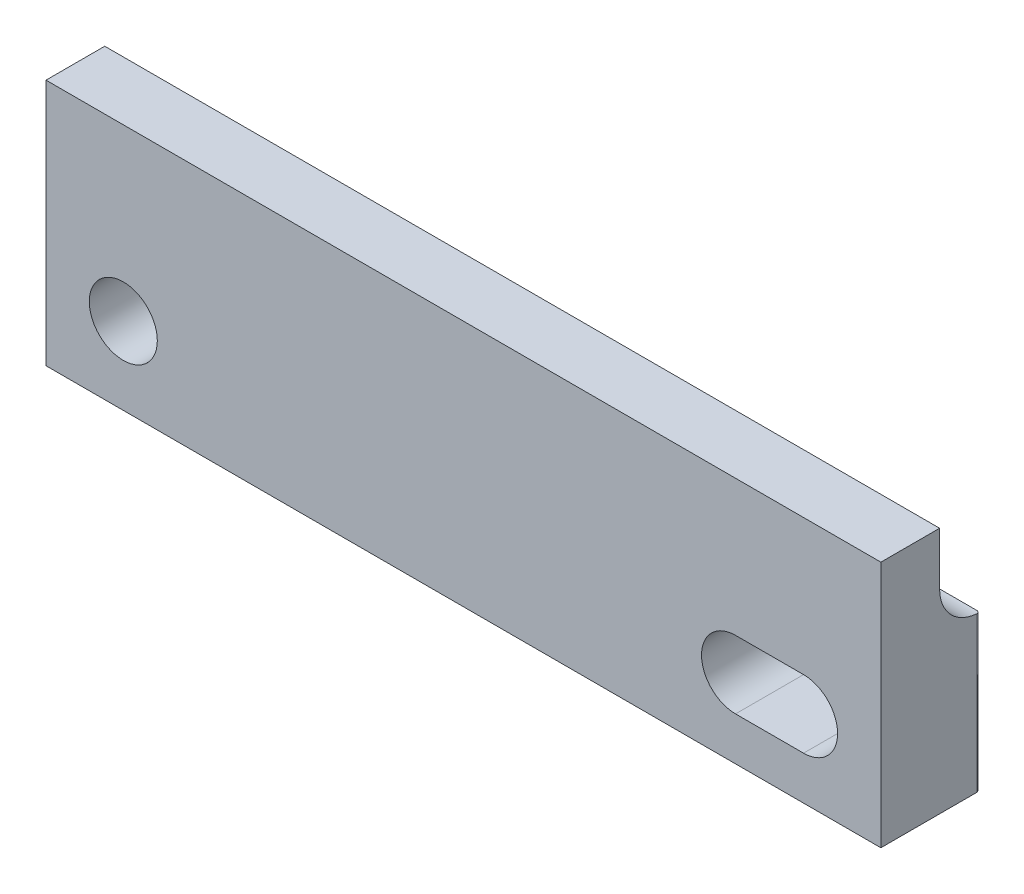
ISO-10303-21;
HEADER;
FILE_DESCRIPTION(('STEP AP214'),'2;1');
FILE_NAME('part.step','',(''),(''),'','','');
FILE_SCHEMA(('AUTOMOTIVE_DESIGN { 1 0 10303 214 1 1 1 1 }'));
ENDSEC;
DATA;
#1=APPLICATION_CONTEXT('core data for automotive mechanical design processes');
#2=APPLICATION_PROTOCOL_DEFINITION('international standard','automotive_design',2000,#1);
#3=PRODUCT_CONTEXT('',#1,'mechanical');
#4=PRODUCT('Part','Part','',(#3));
#5=PRODUCT_RELATED_PRODUCT_CATEGORY('part','',(#4));
#6=PRODUCT_DEFINITION_FORMATION('','',#4);
#7=PRODUCT_DEFINITION_CONTEXT('part definition',#1,'design');
#8=PRODUCT_DEFINITION('design','',#6,#7);
#9=PRODUCT_DEFINITION_SHAPE('','',#8);
#10=(LENGTH_UNIT() NAMED_UNIT(*) SI_UNIT(.MILLI.,.METRE.));
#11=(NAMED_UNIT(*) PLANE_ANGLE_UNIT() SI_UNIT($,.RADIAN.));
#12=(NAMED_UNIT(*) SI_UNIT($,.STERADIAN.) SOLID_ANGLE_UNIT());
#13=UNCERTAINTY_MEASURE_WITH_UNIT(LENGTH_MEASURE(1.E-05),#10,'distance_accuracy_value','');
#14=(GEOMETRIC_REPRESENTATION_CONTEXT(3) GLOBAL_UNCERTAINTY_ASSIGNED_CONTEXT((#13)) GLOBAL_UNIT_ASSIGNED_CONTEXT((#10,
#11,#12)) REPRESENTATION_CONTEXT('',''));
#15=CARTESIAN_POINT('',(0.,0.,0.));
#16=DIRECTION('',(0.,0.,1.));
#17=DIRECTION('',(1.,0.,0.));
#18=AXIS2_PLACEMENT_3D('',#15,#16,#17);
#19=CARTESIAN_POINT('',(0.,0.,32.));
#20=DIRECTION('',(1.,0.,0.));
#21=DIRECTION('',(0.,0.,-1.));
#22=AXIS2_PLACEMENT_3D('',#19,#20,#21);
#23=PLANE('',#22);
#24=CARTESIAN_POINT('',(0.,63.,0.));
#25=DIRECTION('',(-1.,0.,0.));
#26=DIRECTION('',(0.,0.,-1.));
#27=AXIS2_PLACEMENT_3D('',#24,#25,#26);
#28=CIRCLE('',#27,13.);
#29=CARTESIAN_POINT('',(0.,50.0385186031843,1.));
#30=VERTEX_POINT('',#29);
#31=CARTESIAN_POINT('',(0.,63.,13.));
#32=VERTEX_POINT('',#31);
#33=EDGE_CURVE('E140',#30,#32,#28,.T.);
#34=ORIENTED_EDGE('',*,*,#33,.F.);
#35=DIRECTION('',(0.,-1.,0.));
#36=VECTOR('',#35,1.);
#37=CARTESIAN_POINT('',(0.,0.,1.));
#38=LINE('',#37,#36);
#39=CARTESIAN_POINT('',(0.,0.,1.));
#40=VERTEX_POINT('',#39);
#41=EDGE_CURVE('E312',#30,#40,#38,.T.);
#42=ORIENTED_EDGE('',*,*,#41,.T.);
#43=DIRECTION('',(0.,0.,-1.));
#44=VECTOR('',#43,1.);
#45=CARTESIAN_POINT('',(0.,0.,32.));
#46=LINE('',#45,#44);
#47=CARTESIAN_POINT('',(0.,0.,32.));
#48=VERTEX_POINT('',#47);
#49=EDGE_CURVE('E208',#48,#40,#46,.T.);
#50=ORIENTED_EDGE('',*,*,#49,.F.);
#51=DIRECTION('',(0.,-1.,0.));
#52=VECTOR('',#51,1.);
#53=CARTESIAN_POINT('',(0.,0.,32.));
#54=LINE('',#53,#52);
#55=CARTESIAN_POINT('',(0.,80.,32.));
#56=VERTEX_POINT('',#55);
#57=EDGE_CURVE('E190',#56,#48,#54,.T.);
#58=ORIENTED_EDGE('',*,*,#57,.F.);
#59=DIRECTION('',(0.,0.,-1.));
#60=VECTOR('',#59,1.);
#61=CARTESIAN_POINT('',(0.,80.,32.));
#62=LINE('',#61,#60);
#63=CARTESIAN_POINT('',(0.,80.,13.));
#64=VERTEX_POINT('',#63);
#65=EDGE_CURVE('E201',#56,#64,#62,.T.);
#66=ORIENTED_EDGE('',*,*,#65,.T.);
#67=DIRECTION('',(0.,1.,0.));
#68=VECTOR('',#67,1.);
#69=CARTESIAN_POINT('',(0.,80.,13.));
#70=LINE('',#69,#68);
#71=EDGE_CURVE('E133',#32,#64,#70,.T.);
#72=ORIENTED_EDGE('',*,*,#71,.F.);
#73=EDGE_LOOP('',(#34,#42,#50,#58,#66,#72));
#74=FACE_BOUND('',#73,.T.);
#75=ADVANCED_FACE('F34',(#74),#23,.F.);
#76=CARTESIAN_POINT('',(0.,0.,32.));
#77=DIRECTION('',(0.,1.,0.));
#78=DIRECTION('',(0.,0.,1.));
#79=AXIS2_PLACEMENT_3D('',#76,#77,#78);
#80=PLANE('',#79);
#81=ORIENTED_EDGE('',*,*,#49,.T.);
#82=DIRECTION('',(1.,0.,0.));
#83=VECTOR('',#82,1.);
#84=CARTESIAN_POINT('',(269.,0.,1.));
#85=LINE('',#84,#83);
#86=CARTESIAN_POINT('',(270.,0.,1.));
#87=VERTEX_POINT('',#86);
#88=EDGE_CURVE('E238',#40,#87,#85,.T.);
#89=ORIENTED_EDGE('',*,*,#88,.T.);
#90=DIRECTION('',(0.,0.,-1.));
#91=VECTOR('',#90,1.);
#92=CARTESIAN_POINT('',(270.,0.,32.));
#93=LINE('',#92,#91);
#94=CARTESIAN_POINT('',(270.,0.,32.));
#95=VERTEX_POINT('',#94);
#96=EDGE_CURVE('E206',#95,#87,#93,.T.);
#97=ORIENTED_EDGE('',*,*,#96,.F.);
#98=DIRECTION('',(1.,0.,0.));
#99=VECTOR('',#98,1.);
#100=CARTESIAN_POINT('',(0.,0.,32.));
#101=LINE('',#100,#99);
#102=EDGE_CURVE('E195',#48,#95,#101,.T.);
#103=ORIENTED_EDGE('',*,*,#102,.F.);
#104=EDGE_LOOP('',(#81,#89,#97,#103));
#105=FACE_BOUND('',#104,.T.);
#106=ADVANCED_FACE('F251',(#105),#80,.F.);
#107=CARTESIAN_POINT('',(270.,0.,32.));
#108=DIRECTION('',(-1.,0.,0.));
#109=DIRECTION('',(0.,0.,1.));
#110=AXIS2_PLACEMENT_3D('',#107,#108,#109);
#111=PLANE('',#110);
#112=ORIENTED_EDGE('',*,*,#96,.T.);
#113=DIRECTION('',(0.,1.,0.));
#114=VECTOR('',#113,1.);
#115=CARTESIAN_POINT('',(270.,50.,1.));
#116=LINE('',#115,#114);
#117=CARTESIAN_POINT('',(270.,50.0385186031843,1.));
#118=VERTEX_POINT('',#117);
#119=EDGE_CURVE('E131',#87,#118,#116,.T.);
#120=ORIENTED_EDGE('',*,*,#119,.T.);
#121=CARTESIAN_POINT('',(270.,63.,0.));
#122=DIRECTION('',(-1.,0.,0.));
#123=DIRECTION('',(0.,0.,-1.));
#124=AXIS2_PLACEMENT_3D('',#121,#122,#123);
#125=CIRCLE('',#124,13.);
#126=CARTESIAN_POINT('',(270.,63.,13.));
#127=VERTEX_POINT('',#126);
#128=EDGE_CURVE('E123',#118,#127,#125,.T.);
#129=ORIENTED_EDGE('',*,*,#128,.T.);
#130=DIRECTION('',(0.,1.,0.));
#131=VECTOR('',#130,1.);
#132=CARTESIAN_POINT('',(270.,80.,13.));
#133=LINE('',#132,#131);
#134=CARTESIAN_POINT('',(270.,80.,13.));
#135=VERTEX_POINT('',#134);
#136=EDGE_CURVE('E129',#127,#135,#133,.T.);
#137=ORIENTED_EDGE('',*,*,#136,.T.);
#138=DIRECTION('',(0.,0.,-1.));
#139=VECTOR('',#138,1.);
#140=CARTESIAN_POINT('',(270.,80.,32.));
#141=LINE('',#140,#139);
#142=CARTESIAN_POINT('',(270.,80.,32.));
#143=VERTEX_POINT('',#142);
#144=EDGE_CURVE('E204',#143,#135,#141,.T.);
#145=ORIENTED_EDGE('',*,*,#144,.F.);
#146=DIRECTION('',(0.,1.,0.));
#147=VECTOR('',#146,1.);
#148=CARTESIAN_POINT('',(270.,0.,32.));
#149=LINE('',#148,#147);
#150=EDGE_CURVE('E197',#95,#143,#149,.T.);
#151=ORIENTED_EDGE('',*,*,#150,.F.);
#152=EDGE_LOOP('',(#112,#120,#129,#137,#145,#151));
#153=FACE_BOUND('',#152,.T.);
#154=ADVANCED_FACE('F126',(#153),#111,.F.);
#155=CARTESIAN_POINT('',(0.,80.,32.));
#156=DIRECTION('',(0.,-1.,0.));
#157=DIRECTION('',(1.,0.,0.));
#158=AXIS2_PLACEMENT_3D('',#155,#156,#157);
#159=PLANE('',#158);
#160=ORIENTED_EDGE('',*,*,#144,.T.);
#161=DIRECTION('',(-1.,0.,0.));
#162=VECTOR('',#161,1.);
#163=CARTESIAN_POINT('',(270.,80.,13.));
#164=LINE('',#163,#162);
#165=EDGE_CURVE('E143',#135,#64,#164,.T.);
#166=ORIENTED_EDGE('',*,*,#165,.T.);
#167=ORIENTED_EDGE('',*,*,#65,.F.);
#168=DIRECTION('',(-1.,0.,0.));
#169=VECTOR('',#168,1.);
#170=CARTESIAN_POINT('',(0.,80.,32.));
#171=LINE('',#170,#169);
#172=EDGE_CURVE('E199',#143,#56,#171,.T.);
#173=ORIENTED_EDGE('',*,*,#172,.F.);
#174=EDGE_LOOP('',(#160,#166,#167,#173));
#175=FACE_BOUND('',#174,.T.);
#176=ADVANCED_FACE('F261',(#175),#159,.F.);
#177=CARTESIAN_POINT('',(0.,0.,32.));
#178=DIRECTION('',(0.,0.,-1.));
#179=DIRECTION('',(-1.,0.,0.));
#180=AXIS2_PLACEMENT_3D('',#177,#178,#179);
#181=PLANE('',#180);
#182=DIRECTION('',(1.,0.,0.));
#183=VECTOR('',#182,1.);
#184=CARTESIAN_POINT('',(223.000000000001,14.0000000000028,32.));
#185=LINE('',#184,#183);
#186=CARTESIAN_POINT('',(223.000000000001,14.0000000000028,32.));
#187=VERTEX_POINT('',#186);
#188=CARTESIAN_POINT('',(245.,14.0000000000028,32.));
#189=VERTEX_POINT('',#188);
#190=EDGE_CURVE('E170',#187,#189,#185,.T.);
#191=ORIENTED_EDGE('',*,*,#190,.F.);
#192=CARTESIAN_POINT('',(223.000000000007,25.0000000000028,32.));
#193=DIRECTION('',(0.,0.,1.));
#194=DIRECTION('',(-1.,0.,0.));
#195=AXIS2_PLACEMENT_3D('',#192,#193,#194);
#196=CIRCLE('',#195,11.);
#197=CARTESIAN_POINT('',(223.000000000001,36.0000000000028,32.));
#198=VERTEX_POINT('',#197);
#199=EDGE_CURVE('E153',#198,#187,#196,.T.);
#200=ORIENTED_EDGE('',*,*,#199,.F.);
#201=DIRECTION('',(-1.,0.,0.));
#202=VECTOR('',#201,1.);
#203=CARTESIAN_POINT('',(223.000000000001,36.0000000000028,32.));
#204=LINE('',#203,#202);
#205=CARTESIAN_POINT('',(245.,36.0000000000028,32.));
#206=VERTEX_POINT('',#205);
#207=EDGE_CURVE('E159',#206,#198,#204,.T.);
#208=ORIENTED_EDGE('',*,*,#207,.F.);
#209=CARTESIAN_POINT('',(245.,25.0000000000028,32.));
#210=DIRECTION('',(0.,0.,1.));
#211=DIRECTION('',(-1.,0.,0.));
#212=AXIS2_PLACEMENT_3D('',#209,#210,#211);
#213=CIRCLE('',#212,11.);
#214=EDGE_CURVE('E173',#189,#206,#213,.T.);
#215=ORIENTED_EDGE('',*,*,#214,.F.);
#216=EDGE_LOOP('',(#191,#200,#208,#215));
#217=FACE_BOUND('',#216,.T.);
#218=CARTESIAN_POINT('',(25.,25.,32.));
#219=DIRECTION('',(0.,0.,1.));
#220=DIRECTION('',(1.,0.,0.));
#221=AXIS2_PLACEMENT_3D('',#218,#219,#220);
#222=CIRCLE('',#221,11.);
#223=CARTESIAN_POINT('',(36.,25.,32.));
#224=VERTEX_POINT('',#223);
#225=EDGE_CURVE('E180',#224,#224,#222,.T.);
#226=ORIENTED_EDGE('',*,*,#225,.F.);
#227=EDGE_LOOP('',(#226));
#228=FACE_BOUND('',#227,.T.);
#229=ORIENTED_EDGE('',*,*,#57,.T.);
#230=ORIENTED_EDGE('',*,*,#102,.T.);
#231=ORIENTED_EDGE('',*,*,#150,.T.);
#232=ORIENTED_EDGE('',*,*,#172,.T.);
#233=EDGE_LOOP('',(#229,#230,#231,#232));
#234=FACE_BOUND('',#233,.T.);
#235=ADVANCED_FACE('F264',(#217,#228,#234),#181,.F.);
#236=CARTESIAN_POINT('',(0.,0.,0.));
#237=DIRECTION('',(0.,0.,-1.));
#238=DIRECTION('',(-1.,0.,0.));
#239=AXIS2_PLACEMENT_3D('',#236,#237,#238);
#240=PLANE('',#239);
#241=DIRECTION('',(0.,1.,0.));
#242=VECTOR('',#241,1.);
#243=CARTESIAN_POINT('',(269.,0.,0.));
#244=LINE('',#243,#242);
#245=CARTESIAN_POINT('',(269.,50.,0.));
#246=VERTEX_POINT('',#245);
#247=CARTESIAN_POINT('',(269.,1.,0.));
#248=VERTEX_POINT('',#247);
#249=EDGE_CURVE('E219',#246,#248,#244,.F.);
#250=ORIENTED_EDGE('',*,*,#249,.T.);
#251=DIRECTION('',(1.,0.,0.));
#252=VECTOR('',#251,1.);
#253=CARTESIAN_POINT('',(1.,1.,0.));
#254=LINE('',#253,#252);
#255=CARTESIAN_POINT('',(1.,1.,0.));
#256=VERTEX_POINT('',#255);
#257=EDGE_CURVE('E42',#248,#256,#254,.F.);
#258=ORIENTED_EDGE('',*,*,#257,.T.);
#259=DIRECTION('',(0.,-1.,0.));
#260=VECTOR('',#259,1.);
#261=CARTESIAN_POINT('',(1.,50.,0.));
#262=LINE('',#261,#260);
#263=CARTESIAN_POINT('',(1.,50.,0.));
#264=VERTEX_POINT('',#263);
#265=EDGE_CURVE('E239',#256,#264,#262,.F.);
#266=ORIENTED_EDGE('',*,*,#265,.T.);
#267=DIRECTION('',(-1.,0.,0.));
#268=VECTOR('',#267,1.);
#269=CARTESIAN_POINT('',(270.,50.,0.));
#270=LINE('',#269,#268);
#271=EDGE_CURVE('E144',#246,#264,#270,.T.);
#272=ORIENTED_EDGE('',*,*,#271,.F.);
#273=EDGE_LOOP('',(#250,#258,#266,#272));
#274=FACE_BOUND('',#273,.T.);
#275=CARTESIAN_POINT('',(223.000000000007,25.0000000000028,0.));
#276=DIRECTION('',(0.,0.,1.));
#277=DIRECTION('',(-1.,0.,0.));
#278=AXIS2_PLACEMENT_3D('',#275,#276,#277);
#279=CIRCLE('',#278,11.);
#280=CARTESIAN_POINT('',(223.000000000001,36.0000000000028,0.));
#281=VERTEX_POINT('',#280);
#282=CARTESIAN_POINT('',(223.000000000001,14.0000000000028,0.));
#283=VERTEX_POINT('',#282);
#284=EDGE_CURVE('E155',#281,#283,#279,.T.);
#285=ORIENTED_EDGE('',*,*,#284,.T.);
#286=DIRECTION('',(1.,0.,0.));
#287=VECTOR('',#286,1.);
#288=CARTESIAN_POINT('',(223.000000000001,14.0000000000028,0.));
#289=LINE('',#288,#287);
#290=CARTESIAN_POINT('',(245.,14.0000000000028,0.));
#291=VERTEX_POINT('',#290);
#292=EDGE_CURVE('E158',#283,#291,#289,.T.);
#293=ORIENTED_EDGE('',*,*,#292,.T.);
#294=CARTESIAN_POINT('',(245.,25.0000000000028,0.));
#295=DIRECTION('',(0.,0.,1.));
#296=DIRECTION('',(-1.,0.,0.));
#297=AXIS2_PLACEMENT_3D('',#294,#295,#296);
#298=CIRCLE('',#297,11.);
#299=CARTESIAN_POINT('',(245.,36.0000000000028,0.));
#300=VERTEX_POINT('',#299);
#301=EDGE_CURVE('E162',#291,#300,#298,.T.);
#302=ORIENTED_EDGE('',*,*,#301,.T.);
#303=DIRECTION('',(-1.,0.,0.));
#304=VECTOR('',#303,1.);
#305=CARTESIAN_POINT('',(223.000000000001,36.0000000000028,0.));
#306=LINE('',#305,#304);
#307=EDGE_CURVE('E165',#300,#281,#306,.T.);
#308=ORIENTED_EDGE('',*,*,#307,.T.);
#309=EDGE_LOOP('',(#285,#293,#302,#308));
#310=FACE_BOUND('',#309,.T.);
#311=CARTESIAN_POINT('',(25.,25.,0.));
#312=DIRECTION('',(0.,0.,1.));
#313=DIRECTION('',(1.,0.,0.));
#314=AXIS2_PLACEMENT_3D('',#311,#312,#313);
#315=CIRCLE('',#314,11.);
#316=CARTESIAN_POINT('',(36.,25.,0.));
#317=VERTEX_POINT('',#316);
#318=EDGE_CURVE('E187',#317,#317,#315,.T.);
#319=ORIENTED_EDGE('',*,*,#318,.T.);
#320=EDGE_LOOP('',(#319));
#321=FACE_BOUND('',#320,.T.);
#322=ADVANCED_FACE('F266',(#274,#310,#321),#240,.T.);
#323=CARTESIAN_POINT('',(25.,25.,0.));
#324=DIRECTION('',(0.,0.,1.));
#325=DIRECTION('',(1.,0.,0.));
#326=AXIS2_PLACEMENT_3D('',#323,#324,#325);
#327=CYLINDRICAL_SURFACE('',#326,11.);
#328=ORIENTED_EDGE('',*,*,#318,.F.);
#329=EDGE_LOOP('',(#328));
#330=FACE_BOUND('',#329,.T.);
#331=ORIENTED_EDGE('',*,*,#225,.T.);
#332=EDGE_LOOP('',(#331));
#333=FACE_BOUND('',#332,.T.);
#334=ADVANCED_FACE('F269',(#330,#333),#327,.F.);
#335=CARTESIAN_POINT('',(223.000000000007,25.0000000000028,0.));
#336=DIRECTION('',(0.,0.,1.));
#337=DIRECTION('',(1.,0.,0.));
#338=AXIS2_PLACEMENT_3D('',#335,#336,#337);
#339=CYLINDRICAL_SURFACE('',#338,11.);
#340=ORIENTED_EDGE('',*,*,#199,.T.);
#341=DIRECTION('',(0.,0.,1.));
#342=VECTOR('',#341,1.);
#343=CARTESIAN_POINT('',(223.000000000001,14.0000000000028,0.));
#344=LINE('',#343,#342);
#345=EDGE_CURVE('E168',#283,#187,#344,.T.);
#346=ORIENTED_EDGE('',*,*,#345,.F.);
#347=ORIENTED_EDGE('',*,*,#284,.F.);
#348=DIRECTION('',(0.,0.,1.));
#349=VECTOR('',#348,1.);
#350=CARTESIAN_POINT('',(223.000000000001,36.0000000000028,0.));
#351=LINE('',#350,#349);
#352=EDGE_CURVE('E178',#281,#198,#351,.T.);
#353=ORIENTED_EDGE('',*,*,#352,.T.);
#354=EDGE_LOOP('',(#340,#346,#347,#353));
#355=FACE_BOUND('',#354,.T.);
#356=ADVANCED_FACE('F275',(#355),#339,.F.);
#357=CARTESIAN_POINT('',(223.000000000001,36.0000000000028,0.));
#358=DIRECTION('',(0.,1.,0.));
#359=DIRECTION('',(0.,0.,1.));
#360=AXIS2_PLACEMENT_3D('',#357,#358,#359);
#361=PLANE('',#360);
#362=ORIENTED_EDGE('',*,*,#207,.T.);
#363=ORIENTED_EDGE('',*,*,#352,.F.);
#364=ORIENTED_EDGE('',*,*,#307,.F.);
#365=DIRECTION('',(0.,0.,1.));
#366=VECTOR('',#365,1.);
#367=CARTESIAN_POINT('',(245.,36.0000000000028,0.));
#368=LINE('',#367,#366);
#369=EDGE_CURVE('E181',#300,#206,#368,.T.);
#370=ORIENTED_EDGE('',*,*,#369,.T.);
#371=EDGE_LOOP('',(#362,#363,#364,#370));
#372=FACE_BOUND('',#371,.T.);
#373=ADVANCED_FACE('F228',(#372),#361,.F.);
#374=CARTESIAN_POINT('',(245.,25.0000000000028,0.));
#375=DIRECTION('',(0.,0.,1.));
#376=DIRECTION('',(1.,0.,0.));
#377=AXIS2_PLACEMENT_3D('',#374,#375,#376);
#378=CYLINDRICAL_SURFACE('',#377,11.);
#379=ORIENTED_EDGE('',*,*,#214,.T.);
#380=ORIENTED_EDGE('',*,*,#369,.F.);
#381=ORIENTED_EDGE('',*,*,#301,.F.);
#382=DIRECTION('',(0.,0.,1.));
#383=VECTOR('',#382,1.);
#384=CARTESIAN_POINT('',(245.,14.0000000000028,0.));
#385=LINE('',#384,#383);
#386=EDGE_CURVE('E183',#291,#189,#385,.T.);
#387=ORIENTED_EDGE('',*,*,#386,.T.);
#388=EDGE_LOOP('',(#379,#380,#381,#387));
#389=FACE_BOUND('',#388,.T.);
#390=ADVANCED_FACE('F282',(#389),#378,.F.);
#391=CARTESIAN_POINT('',(223.000000000001,14.0000000000028,0.));
#392=DIRECTION('',(0.,-1.,0.));
#393=DIRECTION('',(0.,0.,-1.));
#394=AXIS2_PLACEMENT_3D('',#391,#392,#393);
#395=PLANE('',#394);
#396=ORIENTED_EDGE('',*,*,#190,.T.);
#397=ORIENTED_EDGE('',*,*,#386,.F.);
#398=ORIENTED_EDGE('',*,*,#292,.F.);
#399=ORIENTED_EDGE('',*,*,#345,.T.);
#400=EDGE_LOOP('',(#396,#397,#398,#399));
#401=FACE_BOUND('',#400,.T.);
#402=ADVANCED_FACE('F280',(#401),#395,.F.);
#403=CARTESIAN_POINT('',(270.,80.,13.));
#404=DIRECTION('',(0.,0.,1.));
#405=DIRECTION('',(1.,0.,0.));
#406=AXIS2_PLACEMENT_3D('',#403,#404,#405);
#407=PLANE('',#406);
#408=ORIENTED_EDGE('',*,*,#71,.T.);
#409=ORIENTED_EDGE('',*,*,#165,.F.);
#410=ORIENTED_EDGE('',*,*,#136,.F.);
#411=DIRECTION('',(-1.,0.,0.));
#412=VECTOR('',#411,1.);
#413=CARTESIAN_POINT('',(270.,63.,13.));
#414=LINE('',#413,#412);
#415=EDGE_CURVE('E136',#127,#32,#414,.T.);
#416=ORIENTED_EDGE('',*,*,#415,.T.);
#417=EDGE_LOOP('',(#408,#409,#410,#416));
#418=FACE_BOUND('',#417,.T.);
#419=ADVANCED_FACE('F146',(#418),#407,.F.);
#420=CARTESIAN_POINT('',(270.,63.,0.));
#421=DIRECTION('',(-1.,0.,0.));
#422=DIRECTION('',(0.,0.,1.));
#423=AXIS2_PLACEMENT_3D('',#420,#421,#422);
#424=CYLINDRICAL_SURFACE('',#423,13.);
#425=ORIENTED_EDGE('',*,*,#271,.T.);
#426=CARTESIAN_POINT('',(1.,50.,0.));
#427=CARTESIAN_POINT('',(0.971866894557774,50.0000005260845,1.87330291796761E-07));
#428=CARTESIAN_POINT('',(0.943747266593013,49.9999999408767,0.00118795222718451));
#429=CARTESIAN_POINT('',(0.887709200166625,50.0000010324501,0.00592643205764395));
#430=CARTESIAN_POINT('',(0.859790752168801,50.0000027091234,0.00947703423486635));
#431=CARTESIAN_POINT('',(0.776685370737838,50.0000178412267,0.0236394703531831));
#432=CARTESIAN_POINT('',(0.722055055182016,50.0000413711044,0.0377620267573368));
#433=CARTESIAN_POINT('',(0.615942085877576,50.0002030569174,0.0749774666485381));
#434=CARTESIAN_POINT('',(0.564460967286497,50.0003412682865,0.0980746853641486));
#435=CARTESIAN_POINT('',(0.46610910527747,50.0008669943898,0.152580975583143));
#436=CARTESIAN_POINT('',(0.419237555977939,50.0012544654568,0.183988590640854));
#437=CARTESIAN_POINT('',(0.331447880478626,50.0024385074827,0.254213368283067));
#438=CARTESIAN_POINT('',(0.290528225688141,50.0032349731629,0.293028622464506));
#439=CARTESIAN_POINT('',(0.21578154612516,50.0053992545189,0.376975324135412));
#440=CARTESIAN_POINT('',(0.18195573315321,50.0067671676926,0.422107848576054));
#441=CARTESIAN_POINT('',(0.122392077837033,50.0102108495471,0.517343400105503));
#442=CARTESIAN_POINT('',(0.0966473833296299,50.0122860154009,0.567442168510334));
#443=CARTESIAN_POINT('',(0.053937020453966,50.017235370842,0.67120248961867));
#444=CARTESIAN_POINT('',(0.0369665709067509,50.0201091239553,0.724862083964607));
#445=CARTESIAN_POINT('',(0.0164275889701003,50.0255656540821,0.815702983751959));
#446=CARTESIAN_POINT('',(0.0102689825502042,50.0279193248128,0.852333880478129));
#447=CARTESIAN_POINT('',(0.00205563216074647,50.032967075407,0.925975884706877));
#448=CARTESIAN_POINT('',(-5.02717251911508E-06,50.0356606586228,0.962986366539698));
#449=CARTESIAN_POINT('',(0.,50.0385186031843,1.));
#450=B_SPLINE_CURVE_WITH_KNOTS('',3,(#426,#427,#428,#429,#430,#431,#432,#433,#434,#435,#436,
#437,#438,#439,#440,#441,#442,#443,#444,#445,#446,#447,#448,#449),.UNSPECIFIED.,.F.,.F.,(4,2,2,
2,2,2,2,2,2,2,2,4),(0.,0.0843474797580619,0.168690934680555,0.337101374325562,0.505593266307338,
0.674055648633503,0.842474689055246,1.01092247614878,1.17922704429378,1.34743980458458,
1.45888358679561,1.57016638342241),.UNSPECIFIED.);
#451=EDGE_CURVE('E232',#264,#30,#450,.T.);
#452=ORIENTED_EDGE('',*,*,#451,.T.);
#453=ORIENTED_EDGE('',*,*,#33,.T.);
#454=ORIENTED_EDGE('',*,*,#415,.F.);
#455=ORIENTED_EDGE('',*,*,#128,.F.);
#456=CARTESIAN_POINT('',(270.,50.0385186031843,1.));
#457=CARTESIAN_POINT('',(269.999999816695,50.0363545023318,0.971956619657006));
#458=CARTESIAN_POINT('',(269.998819592766,50.0342835549403,0.943919310323382));
#459=CARTESIAN_POINT('',(269.994107651885,50.0303359519353,0.888030109551464));
#460=CARTESIAN_POINT('',(269.990576002307,50.028459290757,0.860178212823885));
#461=CARTESIAN_POINT('',(269.976481844164,50.0231382541803,0.777247262556744));
#462=CARTESIAN_POINT('',(269.962420058342,50.0199958051017,0.722701511203059));
#463=CARTESIAN_POINT('',(269.925332358392,50.0145270275782,0.616699655054697));
#464=CARTESIAN_POINT('',(269.902301300515,50.0122011688942,0.565245342735763));
#465=CARTESIAN_POINT('',(269.847921540636,50.0082943732234,0.466911691050918));
#466=CARTESIAN_POINT('',(269.816574555009,50.0067132827062,0.420031410350963));
#467=CARTESIAN_POINT('',(269.746504295142,50.0041724130291,0.332256878930683));
#468=CARTESIAN_POINT('',(269.70779258772,50.0032116698302,0.291353416966953));
#469=CARTESIAN_POINT('',(269.624047375946,50.0017506673459,0.216600232866202));
#470=CARTESIAN_POINT('',(269.579012563314,50.0012505035188,0.182751974092382));
#471=CARTESIAN_POINT('',(269.483868916814,50.0005480042704,0.12305707920832));
#472=CARTESIAN_POINT('',(269.433755721874,50.0003459271881,0.0972173990860431));
#473=CARTESIAN_POINT('',(269.329914740192,50.0000956933191,0.0543217737071189));
#474=CARTESIAN_POINT('',(269.276189037888,50.0000474485353,0.0372608114239486));
#475=CARTESIAN_POINT('',(269.185121565326,50.0000079544993,0.0165772204930394));
#476=CARTESIAN_POINT('',(269.148346984335,50.0000029929638,0.0103647509509155));
#477=CARTESIAN_POINT('',(269.074386700982,49.9999999815719,0.0020765196368823));
#478=CARTESIAN_POINT('',(269.037201644181,50.0000019220769,-5.00461797653457E-06));
#479=CARTESIAN_POINT('',(269.,50.,0.));
#480=B_SPLINE_CURVE_WITH_KNOTS('',3,(#456,#457,#458,#459,#460,#461,#462,#463,#464,#465,#466,
#467,#468,#469,#470,#471,#472,#473,#474,#475,#476,#477,#478,#479),.UNSPECIFIED.,.F.,.F.,(4,2,2,
2,2,2,2,2,2,2,2,4),(0.,0.0843289571616539,0.168655498263918,0.337036954422018,0.50551511746764,
0.673958534308401,0.8421395507964,1.01035541610951,1.17871698136471,1.34698222102392,
1.45865259660543,1.57016708723194),.UNSPECIFIED.);
#481=EDGE_CURVE('E212',#118,#246,#480,.T.);
#482=ORIENTED_EDGE('',*,*,#481,.T.);
#483=EDGE_LOOP('',(#425,#452,#453,#454,#455,#482));
#484=FACE_BOUND('',#483,.T.);
#485=ADVANCED_FACE('F138',(#484),#424,.F.);
#486=CARTESIAN_POINT('',(269.,0.,1.));
#487=DIRECTION('',(0.,-1.,0.));
#488=DIRECTION('',(0.,0.,-1.));
#489=AXIS2_PLACEMENT_3D('',#486,#487,#488);
#490=CYLINDRICAL_SURFACE('',#489,1.);
#491=ORIENTED_EDGE('',*,*,#119,.F.);
#492=CARTESIAN_POINT('',(269.,1.,1.));
#493=DIRECTION('',(-0.707106781186547,-0.707106781186547,0.));
#494=DIRECTION('',(0.707106781186547,-0.707106781186547,0.));
#495=AXIS2_PLACEMENT_3D('',#492,#493,#494);
#496=ELLIPSE('',#495,1.41421356237309,1.);
#497=EDGE_CURVE('E56',#87,#248,#496,.F.);
#498=ORIENTED_EDGE('',*,*,#497,.T.);
#499=ORIENTED_EDGE('',*,*,#249,.F.);
#500=ORIENTED_EDGE('',*,*,#481,.F.);
#501=EDGE_LOOP('',(#491,#498,#499,#500));
#502=FACE_BOUND('',#501,.T.);
#503=ADVANCED_FACE('F221',(#502),#490,.T.);
#504=CARTESIAN_POINT('',(1.,0.,1.));
#505=DIRECTION('',(0.,1.,0.));
#506=DIRECTION('',(0.,0.,1.));
#507=AXIS2_PLACEMENT_3D('',#504,#505,#506);
#508=CYLINDRICAL_SURFACE('',#507,1.);
#509=ORIENTED_EDGE('',*,*,#265,.F.);
#510=CARTESIAN_POINT('',(1.,1.,1.));
#511=DIRECTION('',(-0.707106781186547,0.707106781186547,0.));
#512=DIRECTION('',(0.707106781186547,0.707106781186547,0.));
#513=AXIS2_PLACEMENT_3D('',#510,#511,#512);
#514=ELLIPSE('',#513,1.41421356237309,1.);
#515=EDGE_CURVE('E11',#256,#40,#514,.T.);
#516=ORIENTED_EDGE('',*,*,#515,.T.);
#517=ORIENTED_EDGE('',*,*,#41,.F.);
#518=ORIENTED_EDGE('',*,*,#451,.F.);
#519=EDGE_LOOP('',(#509,#516,#517,#518));
#520=FACE_BOUND('',#519,.T.);
#521=ADVANCED_FACE('F241',(#520),#508,.T.);
#522=CARTESIAN_POINT('',(0.,1.,1.));
#523=DIRECTION('',(-1.,0.,0.));
#524=DIRECTION('',(0.,0.,1.));
#525=AXIS2_PLACEMENT_3D('',#522,#523,#524);
#526=CYLINDRICAL_SURFACE('',#525,1.);
#527=ORIENTED_EDGE('',*,*,#515,.F.);
#528=ORIENTED_EDGE('',*,*,#257,.F.);
#529=ORIENTED_EDGE('',*,*,#497,.F.);
#530=ORIENTED_EDGE('',*,*,#88,.F.);
#531=EDGE_LOOP('',(#527,#528,#529,#530));
#532=FACE_BOUND('',#531,.T.);
#533=ADVANCED_FACE('F36',(#532),#526,.T.);
#534=CLOSED_SHELL('',(#75,#106,#154,#176,#235,#322,#334,#356,#373,#390,#402,#419,#485,#503,#521,#533));
#535=MANIFOLD_SOLID_BREP('B2',#534);
#536=ADVANCED_BREP_SHAPE_REPRESENTATION('',(#18,#535),#14);
#537=SHAPE_DEFINITION_REPRESENTATION(#9,#536);
ENDSEC;
END-ISO-10303-21;
